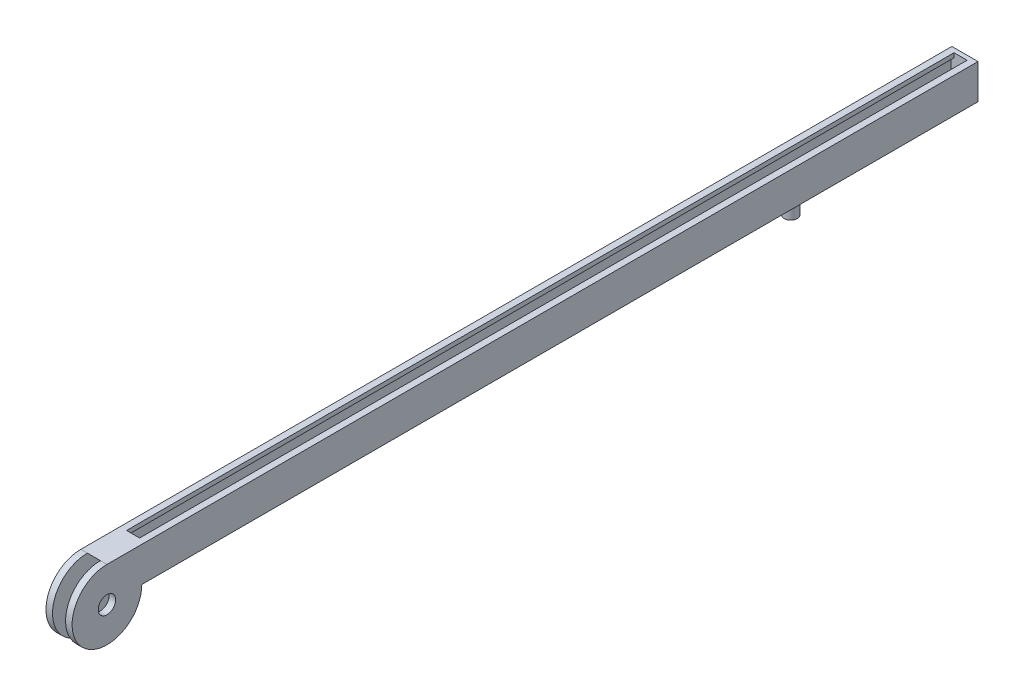
ISO-10303-21;
HEADER;
FILE_DESCRIPTION(('STEP AP214'),'2;1');
FILE_NAME('part.step','',(''),(''),'','','');
FILE_SCHEMA(('AUTOMOTIVE_DESIGN { 1 0 10303 214 1 1 1 1 }'));
ENDSEC;
DATA;
#1=APPLICATION_CONTEXT('core data for automotive mechanical design processes');
#2=APPLICATION_PROTOCOL_DEFINITION('international standard','automotive_design',2000,#1);
#3=PRODUCT_CONTEXT('',#1,'mechanical');
#4=PRODUCT('Part','Part','',(#3));
#5=PRODUCT_RELATED_PRODUCT_CATEGORY('part','',(#4));
#6=PRODUCT_DEFINITION_FORMATION('','',#4);
#7=PRODUCT_DEFINITION_CONTEXT('part definition',#1,'design');
#8=PRODUCT_DEFINITION('design','',#6,#7);
#9=PRODUCT_DEFINITION_SHAPE('','',#8);
#10=(LENGTH_UNIT() NAMED_UNIT(*) SI_UNIT(.MILLI.,.METRE.));
#11=(NAMED_UNIT(*) PLANE_ANGLE_UNIT() SI_UNIT($,.RADIAN.));
#12=(NAMED_UNIT(*) SI_UNIT($,.STERADIAN.) SOLID_ANGLE_UNIT());
#13=UNCERTAINTY_MEASURE_WITH_UNIT(LENGTH_MEASURE(1.E-05),#10,'distance_accuracy_value','');
#14=(GEOMETRIC_REPRESENTATION_CONTEXT(3) GLOBAL_UNCERTAINTY_ASSIGNED_CONTEXT((#13)) GLOBAL_UNIT_ASSIGNED_CONTEXT((#10,
#11,#12)) REPRESENTATION_CONTEXT('',''));
#15=CARTESIAN_POINT('',(0.,0.,0.));
#16=DIRECTION('',(0.,0.,1.));
#17=DIRECTION('',(1.,0.,0.));
#18=AXIS2_PLACEMENT_3D('',#15,#16,#17);
#19=CARTESIAN_POINT('',(-226.274169979695,0.,0.));
#20=DIRECTION('',(1.,0.,0.));
#21=DIRECTION('',(0.,0.,-1.));
#22=AXIS2_PLACEMENT_3D('',#19,#20,#21);
#23=CYLINDRICAL_SURFACE('',#22,80.);
#24=DIRECTION('',(1.,0.,0.));
#25=VECTOR('',#24,1.);
#26=CARTESIAN_POINT('',(0.,80.,0.));
#27=LINE('',#26,#25);
#28=CARTESIAN_POINT('',(45.,80.,0.));
#29=VERTEX_POINT('',#28);
#30=CARTESIAN_POINT('',(60.,80.,0.));
#31=VERTEX_POINT('',#30);
#32=EDGE_CURVE('E162',#29,#31,#27,.T.);
#33=ORIENTED_EDGE('',*,*,#32,.F.);
#34=CARTESIAN_POINT('',(45.,0.,0.));
#35=DIRECTION('',(1.,0.,0.));
#36=DIRECTION('',(0.,0.,-1.));
#37=AXIS2_PLACEMENT_3D('',#34,#35,#36);
#38=CIRCLE('',#37,80.);
#39=CARTESIAN_POINT('',(45.,0.,-80.));
#40=VERTEX_POINT('',#39);
#41=EDGE_CURVE('E148',#29,#40,#38,.T.);
#42=ORIENTED_EDGE('',*,*,#41,.T.);
#43=DIRECTION('',(1.,0.,0.));
#44=VECTOR('',#43,1.);
#45=CARTESIAN_POINT('',(-226.274169979695,0.,-80.));
#46=LINE('',#45,#44);
#47=CARTESIAN_POINT('',(60.,0.,-80.));
#48=VERTEX_POINT('',#47);
#49=EDGE_CURVE('E151',#48,#40,#46,.F.);
#50=ORIENTED_EDGE('',*,*,#49,.F.);
#51=CARTESIAN_POINT('',(60.,0.,0.));
#52=DIRECTION('',(1.,0.,0.));
#53=DIRECTION('',(0.,0.,-1.));
#54=AXIS2_PLACEMENT_3D('',#51,#52,#53);
#55=CIRCLE('',#54,80.);
#56=EDGE_CURVE('E164',#31,#48,#55,.T.);
#57=ORIENTED_EDGE('',*,*,#56,.F.);
#58=EDGE_LOOP('',(#33,#42,#50,#57));
#59=FACE_BOUND('',#58,.T.);
#60=ADVANCED_FACE('F43',(#59),#23,.T.);
#61=CARTESIAN_POINT('',(0.,80.,0.));
#62=DIRECTION('',(0.,1.,0.));
#63=DIRECTION('',(0.,0.,1.));
#64=AXIS2_PLACEMENT_3D('',#61,#62,#63);
#65=PLANE('',#64);
#66=DIRECTION('',(0.,0.,1.));
#67=VECTOR('',#66,1.);
#68=CARTESIAN_POINT('',(-2.35922392732846E-13,80.,-2000.));
#69=LINE('',#68,#67);
#70=CARTESIAN_POINT('',(-2.35922392732846E-13,80.,-2000.));
#71=VERTEX_POINT('',#70);
#72=CARTESIAN_POINT('',(0.,80.,0.));
#73=VERTEX_POINT('',#72);
#74=EDGE_CURVE('E169',#71,#73,#69,.T.);
#75=ORIENTED_EDGE('',*,*,#74,.T.);
#76=CARTESIAN_POINT('',(15.,80.,0.));
#77=VERTEX_POINT('',#76);
#78=EDGE_CURVE('E168',#73,#77,#27,.T.);
#79=ORIENTED_EDGE('',*,*,#78,.T.);
#80=EDGE_CURVE('E160',#77,#29,#27,.T.);
#81=ORIENTED_EDGE('',*,*,#80,.T.);
#82=ORIENTED_EDGE('',*,*,#32,.T.);
#83=DIRECTION('',(0.,0.,-1.));
#84=VECTOR('',#83,1.);
#85=CARTESIAN_POINT('',(60.,80.,0.));
#86=LINE('',#85,#84);
#87=CARTESIAN_POINT('',(60.,80.,-2000.));
#88=VERTEX_POINT('',#87);
#89=EDGE_CURVE('E171',#31,#88,#86,.T.);
#90=ORIENTED_EDGE('',*,*,#89,.T.);
#91=DIRECTION('',(-1.,0.,0.));
#92=VECTOR('',#91,1.);
#93=CARTESIAN_POINT('',(60.,80.,-2000.));
#94=LINE('',#93,#92);
#95=EDGE_CURVE('E178',#88,#71,#94,.T.);
#96=ORIENTED_EDGE('',*,*,#95,.T.);
#97=EDGE_LOOP('',(#75,#79,#81,#82,#90,#96));
#98=FACE_BOUND('',#97,.T.);
#99=DIRECTION('',(0.,0.,1.));
#100=VECTOR('',#99,1.);
#101=CARTESIAN_POINT('',(15.,80.,-1990.));
#102=LINE('',#101,#100);
#103=CARTESIAN_POINT('',(15.,80.,-1990.));
#104=VERTEX_POINT('',#103);
#105=CARTESIAN_POINT('',(15.,80.,-90.));
#106=VERTEX_POINT('',#105);
#107=EDGE_CURVE('E190',#104,#106,#102,.T.);
#108=ORIENTED_EDGE('',*,*,#107,.F.);
#109=DIRECTION('',(1.,0.,0.));
#110=VECTOR('',#109,1.);
#111=CARTESIAN_POINT('',(15.,80.,-1990.));
#112=LINE('',#111,#110);
#113=CARTESIAN_POINT('',(45.,80.,-1990.));
#114=VERTEX_POINT('',#113);
#115=EDGE_CURVE('E256',#104,#114,#112,.T.);
#116=ORIENTED_EDGE('',*,*,#115,.T.);
#117=DIRECTION('',(0.,0.,1.));
#118=VECTOR('',#117,1.);
#119=CARTESIAN_POINT('',(45.,80.,-1990.));
#120=LINE('',#119,#118);
#121=CARTESIAN_POINT('',(45.,80.,-90.));
#122=VERTEX_POINT('',#121);
#123=EDGE_CURVE('E281',#114,#122,#120,.T.);
#124=ORIENTED_EDGE('',*,*,#123,.T.);
#125=DIRECTION('',(1.,0.,0.));
#126=VECTOR('',#125,1.);
#127=CARTESIAN_POINT('',(15.,80.,-90.));
#128=LINE('',#127,#126);
#129=EDGE_CURVE('E238',#106,#122,#128,.T.);
#130=ORIENTED_EDGE('',*,*,#129,.F.);
#131=EDGE_LOOP('',(#108,#116,#124,#130));
#132=FACE_BOUND('',#131,.T.);
#133=ADVANCED_FACE('F173',(#98,#132),#65,.T.);
#134=CARTESIAN_POINT('',(-2.35922392732846E-13,80.,-2000.));
#135=DIRECTION('',(1.,0.,0.));
#136=DIRECTION('',(0.,0.,-1.));
#137=AXIS2_PLACEMENT_3D('',#134,#135,#136);
#138=PLANE('',#137);
#139=CARTESIAN_POINT('',(0.,0.,0.));
#140=DIRECTION('',(1.,0.,0.));
#141=DIRECTION('',(0.,0.,-1.));
#142=AXIS2_PLACEMENT_3D('',#139,#140,#141);
#143=CIRCLE('',#142,20.);
#144=CARTESIAN_POINT('',(0.,0.,-20.));
#145=VERTEX_POINT('',#144);
#146=EDGE_CURVE('E200',#145,#145,#143,.F.);
#147=ORIENTED_EDGE('',*,*,#146,.F.);
#148=EDGE_LOOP('',(#147));
#149=FACE_BOUND('',#148,.T.);
#150=DIRECTION('',(0.,0.,1.));
#151=VECTOR('',#150,1.);
#152=CARTESIAN_POINT('',(-2.35922392732846E-13,0.,-2000.));
#153=LINE('',#152,#151);
#154=CARTESIAN_POINT('',(-2.35922392732846E-13,0.,-2000.));
#155=VERTEX_POINT('',#154);
#156=CARTESIAN_POINT('',(0.,0.,-80.0000000000001));
#157=VERTEX_POINT('',#156);
#158=EDGE_CURVE('E181',#155,#157,#153,.T.);
#159=ORIENTED_EDGE('',*,*,#158,.T.);
#160=CARTESIAN_POINT('',(0.,0.,0.));
#161=DIRECTION('',(1.,0.,0.));
#162=DIRECTION('',(0.,0.,-1.));
#163=AXIS2_PLACEMENT_3D('',#160,#161,#162);
#164=CIRCLE('',#163,80.);
#165=EDGE_CURVE('E234',#157,#73,#164,.F.);
#166=ORIENTED_EDGE('',*,*,#165,.T.);
#167=ORIENTED_EDGE('',*,*,#74,.F.);
#168=DIRECTION('',(0.,-1.,0.));
#169=VECTOR('',#168,1.);
#170=CARTESIAN_POINT('',(-2.35922392732846E-13,80.,-2000.));
#171=LINE('',#170,#169);
#172=EDGE_CURVE('E185',#71,#155,#171,.T.);
#173=ORIENTED_EDGE('',*,*,#172,.T.);
#174=EDGE_LOOP('',(#159,#166,#167,#173));
#175=FACE_BOUND('',#174,.T.);
#176=ADVANCED_FACE('F44',(#149,#175),#138,.F.);
#177=CARTESIAN_POINT('',(60.,80.,0.));
#178=DIRECTION('',(-1.,0.,0.));
#179=DIRECTION('',(0.,0.,1.));
#180=AXIS2_PLACEMENT_3D('',#177,#178,#179);
#181=PLANE('',#180);
#182=CARTESIAN_POINT('',(60.,0.,0.));
#183=DIRECTION('',(1.,0.,0.));
#184=DIRECTION('',(0.,0.,-1.));
#185=AXIS2_PLACEMENT_3D('',#182,#183,#184);
#186=CIRCLE('',#185,20.);
#187=CARTESIAN_POINT('',(60.,0.,-20.));
#188=VERTEX_POINT('',#187);
#189=EDGE_CURVE('E224',#188,#188,#186,.T.);
#190=ORIENTED_EDGE('',*,*,#189,.F.);
#191=EDGE_LOOP('',(#190));
#192=FACE_BOUND('',#191,.T.);
#193=ORIENTED_EDGE('',*,*,#56,.T.);
#194=DIRECTION('',(0.,0.,-1.));
#195=VECTOR('',#194,1.);
#196=CARTESIAN_POINT('',(60.,0.,0.));
#197=LINE('',#196,#195);
#198=CARTESIAN_POINT('',(60.,0.,-2000.));
#199=VERTEX_POINT('',#198);
#200=EDGE_CURVE('E187',#48,#199,#197,.T.);
#201=ORIENTED_EDGE('',*,*,#200,.T.);
#202=DIRECTION('',(0.,-1.,0.));
#203=VECTOR('',#202,1.);
#204=CARTESIAN_POINT('',(60.,80.,-2000.));
#205=LINE('',#204,#203);
#206=EDGE_CURVE('E195',#88,#199,#205,.T.);
#207=ORIENTED_EDGE('',*,*,#206,.F.);
#208=ORIENTED_EDGE('',*,*,#89,.F.);
#209=EDGE_LOOP('',(#193,#201,#207,#208));
#210=FACE_BOUND('',#209,.T.);
#211=ADVANCED_FACE('F416',(#192,#210),#181,.F.);
#212=CARTESIAN_POINT('',(60.,80.,-2000.));
#213=DIRECTION('',(0.,0.,1.));
#214=DIRECTION('',(1.,0.,0.));
#215=AXIS2_PLACEMENT_3D('',#212,#213,#214);
#216=PLANE('',#215);
#217=DIRECTION('',(-1.,0.,0.));
#218=VECTOR('',#217,1.);
#219=CARTESIAN_POINT('',(60.,0.,-2000.));
#220=LINE('',#219,#218);
#221=EDGE_CURVE('E189',#199,#155,#220,.T.);
#222=ORIENTED_EDGE('',*,*,#221,.T.);
#223=ORIENTED_EDGE('',*,*,#172,.F.);
#224=ORIENTED_EDGE('',*,*,#95,.F.);
#225=ORIENTED_EDGE('',*,*,#206,.T.);
#226=EDGE_LOOP('',(#222,#223,#224,#225));
#227=FACE_BOUND('',#226,.T.);
#228=ADVANCED_FACE('F414',(#227),#216,.F.);
#229=CARTESIAN_POINT('',(0.,0.,0.));
#230=DIRECTION('',(0.,1.,0.));
#231=DIRECTION('',(0.,0.,1.));
#232=AXIS2_PLACEMENT_3D('',#229,#230,#231);
#233=PLANE('',#232);
#234=CARTESIAN_POINT('',(29.9999999999999,0.,-1600.));
#235=DIRECTION('',(0.,1.,0.));
#236=DIRECTION('',(0.,0.,1.));
#237=AXIS2_PLACEMENT_3D('',#234,#235,#236);
#238=CIRCLE('',#237,15.);
#239=CARTESIAN_POINT('',(29.9999999999999,0.,-1585.));
#240=VERTEX_POINT('',#239);
#241=EDGE_CURVE('E11',#240,#240,#238,.F.);
#242=ORIENTED_EDGE('',*,*,#241,.F.);
#243=EDGE_LOOP('',(#242));
#244=FACE_BOUND('',#243,.T.);
#245=ORIENTED_EDGE('',*,*,#200,.F.);
#246=ORIENTED_EDGE('',*,*,#49,.T.);
#247=CARTESIAN_POINT('',(15.,0.,-80.));
#248=VERTEX_POINT('',#247);
#249=EDGE_CURVE('E157',#40,#248,#46,.F.);
#250=ORIENTED_EDGE('',*,*,#249,.T.);
#251=EDGE_CURVE('E69',#248,#157,#46,.F.);
#252=ORIENTED_EDGE('',*,*,#251,.T.);
#253=ORIENTED_EDGE('',*,*,#158,.F.);
#254=ORIENTED_EDGE('',*,*,#221,.F.);
#255=EDGE_LOOP('',(#245,#246,#250,#252,#253,#254));
#256=FACE_BOUND('',#255,.T.);
#257=ADVANCED_FACE('F403',(#244,#256),#233,.F.);
#258=CARTESIAN_POINT('',(15.,80.,-1990.));
#259=DIRECTION('',(-1.,0.,0.));
#260=DIRECTION('',(0.,0.,1.));
#261=AXIS2_PLACEMENT_3D('',#258,#259,#260);
#262=PLANE('',#261);
#263=DIRECTION('',(0.,-1.,0.));
#264=VECTOR('',#263,1.);
#265=CARTESIAN_POINT('',(15.,80.,-90.));
#266=LINE('',#265,#264);
#267=CARTESIAN_POINT('',(15.,70.,-90.));
#268=VERTEX_POINT('',#267);
#269=EDGE_CURVE('E233',#106,#268,#266,.T.);
#270=ORIENTED_EDGE('',*,*,#269,.T.);
#271=DIRECTION('',(0.,0.,1.));
#272=VECTOR('',#271,1.);
#273=CARTESIAN_POINT('',(15.,70.,-1990.));
#274=LINE('',#273,#272);
#275=CARTESIAN_POINT('',(15.,70.,-1990.));
#276=VERTEX_POINT('',#275);
#277=EDGE_CURVE('E261',#276,#268,#274,.T.);
#278=ORIENTED_EDGE('',*,*,#277,.F.);
#279=DIRECTION('',(0.,-1.,0.));
#280=VECTOR('',#279,1.);
#281=CARTESIAN_POINT('',(15.,80.,-1990.));
#282=LINE('',#281,#280);
#283=EDGE_CURVE('E237',#104,#276,#282,.T.);
#284=ORIENTED_EDGE('',*,*,#283,.F.);
#285=ORIENTED_EDGE('',*,*,#107,.T.);
#286=EDGE_LOOP('',(#270,#278,#284,#285));
#287=FACE_BOUND('',#286,.T.);
#288=ADVANCED_FACE('F307',(#287),#262,.F.);
#289=CARTESIAN_POINT('',(45.,70.,-1990.));
#290=DIRECTION('',(1.,0.,0.));
#291=DIRECTION('',(0.,0.,-1.));
#292=AXIS2_PLACEMENT_3D('',#289,#290,#291);
#293=PLANE('',#292);
#294=DIRECTION('',(0.,1.,0.));
#295=VECTOR('',#294,1.);
#296=CARTESIAN_POINT('',(45.,70.,-90.));
#297=LINE('',#296,#295);
#298=CARTESIAN_POINT('',(45.,70.,-90.));
#299=VERTEX_POINT('',#298);
#300=EDGE_CURVE('E276',#299,#122,#297,.T.);
#301=ORIENTED_EDGE('',*,*,#300,.T.);
#302=ORIENTED_EDGE('',*,*,#123,.F.);
#303=DIRECTION('',(0.,1.,0.));
#304=VECTOR('',#303,1.);
#305=CARTESIAN_POINT('',(45.,70.,-1990.));
#306=LINE('',#305,#304);
#307=CARTESIAN_POINT('',(45.,70.,-1990.));
#308=VERTEX_POINT('',#307);
#309=EDGE_CURVE('E254',#308,#114,#306,.T.);
#310=ORIENTED_EDGE('',*,*,#309,.F.);
#311=DIRECTION('',(0.,0.,1.));
#312=VECTOR('',#311,1.);
#313=CARTESIAN_POINT('',(45.,70.,-1990.));
#314=LINE('',#313,#312);
#315=EDGE_CURVE('E290',#308,#299,#314,.T.);
#316=ORIENTED_EDGE('',*,*,#315,.T.);
#317=EDGE_LOOP('',(#301,#302,#310,#316));
#318=FACE_BOUND('',#317,.T.);
#319=ADVANCED_FACE('F311',(#318),#293,.F.);
#320=CARTESIAN_POINT('',(52.,70.,-1990.));
#321=DIRECTION('',(0.,1.,0.));
#322=DIRECTION('',(0.,0.,1.));
#323=AXIS2_PLACEMENT_3D('',#320,#321,#322);
#324=PLANE('',#323);
#325=DIRECTION('',(-1.,0.,0.));
#326=VECTOR('',#325,1.);
#327=CARTESIAN_POINT('',(52.,70.,-90.));
#328=LINE('',#327,#326);
#329=CARTESIAN_POINT('',(52.,70.,-90.));
#330=VERTEX_POINT('',#329);
#331=EDGE_CURVE('E277',#330,#299,#328,.T.);
#332=ORIENTED_EDGE('',*,*,#331,.T.);
#333=ORIENTED_EDGE('',*,*,#315,.F.);
#334=DIRECTION('',(-1.,0.,0.));
#335=VECTOR('',#334,1.);
#336=CARTESIAN_POINT('',(52.,70.,-1990.));
#337=LINE('',#336,#335);
#338=CARTESIAN_POINT('',(52.,70.,-1990.));
#339=VERTEX_POINT('',#338);
#340=EDGE_CURVE('E252',#339,#308,#337,.T.);
#341=ORIENTED_EDGE('',*,*,#340,.F.);
#342=DIRECTION('',(0.,0.,1.));
#343=VECTOR('',#342,1.);
#344=CARTESIAN_POINT('',(52.,70.,-1990.));
#345=LINE('',#344,#343);
#346=EDGE_CURVE('E288',#339,#330,#345,.T.);
#347=ORIENTED_EDGE('',*,*,#346,.T.);
#348=EDGE_LOOP('',(#332,#333,#341,#347));
#349=FACE_BOUND('',#348,.T.);
#350=ADVANCED_FACE('F320',(#349),#324,.F.);
#351=CARTESIAN_POINT('',(52.,10.,-1990.));
#352=DIRECTION('',(1.,0.,0.));
#353=DIRECTION('',(0.,0.,-1.));
#354=AXIS2_PLACEMENT_3D('',#351,#352,#353);
#355=PLANE('',#354);
#356=DIRECTION('',(0.,1.,0.));
#357=VECTOR('',#356,1.);
#358=CARTESIAN_POINT('',(52.,10.,-90.));
#359=LINE('',#358,#357);
#360=CARTESIAN_POINT('',(52.,10.,-90.));
#361=VERTEX_POINT('',#360);
#362=EDGE_CURVE('E272',#361,#330,#359,.T.);
#363=ORIENTED_EDGE('',*,*,#362,.T.);
#364=ORIENTED_EDGE('',*,*,#346,.F.);
#365=DIRECTION('',(0.,1.,0.));
#366=VECTOR('',#365,1.);
#367=CARTESIAN_POINT('',(52.,10.,-1990.));
#368=LINE('',#367,#366);
#369=CARTESIAN_POINT('',(52.,10.,-1990.));
#370=VERTEX_POINT('',#369);
#371=EDGE_CURVE('E248',#370,#339,#368,.T.);
#372=ORIENTED_EDGE('',*,*,#371,.F.);
#373=DIRECTION('',(0.,0.,1.));
#374=VECTOR('',#373,1.);
#375=CARTESIAN_POINT('',(52.,10.,-1990.));
#376=LINE('',#375,#374);
#377=EDGE_CURVE('E295',#370,#361,#376,.T.);
#378=ORIENTED_EDGE('',*,*,#377,.T.);
#379=EDGE_LOOP('',(#363,#364,#372,#378));
#380=FACE_BOUND('',#379,.T.);
#381=ADVANCED_FACE('F319',(#380),#355,.F.);
#382=CARTESIAN_POINT('',(8.00000000000001,10.,-1990.));
#383=DIRECTION('',(0.,-1.,0.));
#384=DIRECTION('',(0.,0.,-1.));
#385=AXIS2_PLACEMENT_3D('',#382,#383,#384);
#386=PLANE('',#385);
#387=DIRECTION('',(1.,0.,0.));
#388=VECTOR('',#387,1.);
#389=CARTESIAN_POINT('',(8.00000000000001,10.,-90.));
#390=LINE('',#389,#388);
#391=CARTESIAN_POINT('',(8.00000000000001,10.,-90.));
#392=VERTEX_POINT('',#391);
#393=EDGE_CURVE('E269',#392,#361,#390,.T.);
#394=ORIENTED_EDGE('',*,*,#393,.T.);
#395=ORIENTED_EDGE('',*,*,#377,.F.);
#396=DIRECTION('',(1.,0.,0.));
#397=VECTOR('',#396,1.);
#398=CARTESIAN_POINT('',(8.00000000000001,10.,-1990.));
#399=LINE('',#398,#397);
#400=CARTESIAN_POINT('',(8.00000000000001,10.,-1990.));
#401=VERTEX_POINT('',#400);
#402=EDGE_CURVE('E249',#401,#370,#399,.T.);
#403=ORIENTED_EDGE('',*,*,#402,.F.);
#404=DIRECTION('',(0.,0.,1.));
#405=VECTOR('',#404,1.);
#406=CARTESIAN_POINT('',(8.00000000000001,10.,-1990.));
#407=LINE('',#406,#405);
#408=EDGE_CURVE('E294',#401,#392,#407,.T.);
#409=ORIENTED_EDGE('',*,*,#408,.T.);
#410=EDGE_LOOP('',(#394,#395,#403,#409));
#411=FACE_BOUND('',#410,.T.);
#412=ADVANCED_FACE('F322',(#411),#386,.F.);
#413=CARTESIAN_POINT('',(8.,70.,-1990.));
#414=DIRECTION('',(-1.,0.,0.));
#415=DIRECTION('',(0.,-1.,0.));
#416=AXIS2_PLACEMENT_3D('',#413,#414,#415);
#417=PLANE('',#416);
#418=DIRECTION('',(0.,-1.,0.));
#419=VECTOR('',#418,1.);
#420=CARTESIAN_POINT('',(8.,70.,-90.));
#421=LINE('',#420,#419);
#422=CARTESIAN_POINT('',(8.,70.,-90.));
#423=VERTEX_POINT('',#422);
#424=EDGE_CURVE('E270',#423,#392,#421,.T.);
#425=ORIENTED_EDGE('',*,*,#424,.T.);
#426=ORIENTED_EDGE('',*,*,#408,.F.);
#427=DIRECTION('',(0.,-1.,0.));
#428=VECTOR('',#427,1.);
#429=CARTESIAN_POINT('',(8.,70.,-1990.));
#430=LINE('',#429,#428);
#431=CARTESIAN_POINT('',(8.,70.,-1990.));
#432=VERTEX_POINT('',#431);
#433=EDGE_CURVE('E243',#432,#401,#430,.T.);
#434=ORIENTED_EDGE('',*,*,#433,.F.);
#435=DIRECTION('',(0.,0.,1.));
#436=VECTOR('',#435,1.);
#437=CARTESIAN_POINT('',(8.,70.,-1990.));
#438=LINE('',#437,#436);
#439=EDGE_CURVE('E297',#432,#423,#438,.T.);
#440=ORIENTED_EDGE('',*,*,#439,.T.);
#441=EDGE_LOOP('',(#425,#426,#434,#440));
#442=FACE_BOUND('',#441,.T.);
#443=ADVANCED_FACE('F326',(#442),#417,.F.);
#444=CARTESIAN_POINT('',(15.,70.,-1990.));
#445=DIRECTION('',(0.,1.,0.));
#446=DIRECTION('',(0.,0.,1.));
#447=AXIS2_PLACEMENT_3D('',#444,#445,#446);
#448=PLANE('',#447);
#449=DIRECTION('',(-1.,0.,0.));
#450=VECTOR('',#449,1.);
#451=CARTESIAN_POINT('',(15.,70.,-90.));
#452=LINE('',#451,#450);
#453=EDGE_CURVE('E262',#268,#423,#452,.T.);
#454=ORIENTED_EDGE('',*,*,#453,.T.);
#455=ORIENTED_EDGE('',*,*,#439,.F.);
#456=DIRECTION('',(-1.,0.,0.));
#457=VECTOR('',#456,1.);
#458=CARTESIAN_POINT('',(15.,70.,-1990.));
#459=LINE('',#458,#457);
#460=EDGE_CURVE('E239',#276,#432,#459,.T.);
#461=ORIENTED_EDGE('',*,*,#460,.F.);
#462=ORIENTED_EDGE('',*,*,#277,.T.);
#463=EDGE_LOOP('',(#454,#455,#461,#462));
#464=FACE_BOUND('',#463,.T.);
#465=ADVANCED_FACE('F296',(#464),#448,.F.);
#466=CARTESIAN_POINT('',(0.,0.,-1990.));
#467=DIRECTION('',(0.,0.,-1.));
#468=DIRECTION('',(-1.,0.,0.));
#469=AXIS2_PLACEMENT_3D('',#466,#467,#468);
#470=PLANE('',#469);
#471=ORIENTED_EDGE('',*,*,#283,.T.);
#472=ORIENTED_EDGE('',*,*,#460,.T.);
#473=ORIENTED_EDGE('',*,*,#433,.T.);
#474=ORIENTED_EDGE('',*,*,#402,.T.);
#475=ORIENTED_EDGE('',*,*,#371,.T.);
#476=ORIENTED_EDGE('',*,*,#340,.T.);
#477=ORIENTED_EDGE('',*,*,#309,.T.);
#478=ORIENTED_EDGE('',*,*,#115,.F.);
#479=EDGE_LOOP('',(#471,#472,#473,#474,#475,#476,#477,#478));
#480=FACE_BOUND('',#479,.T.);
#481=ADVANCED_FACE('F328',(#480),#470,.F.);
#482=CARTESIAN_POINT('',(0.,0.,-90.));
#483=DIRECTION('',(0.,0.,-1.));
#484=DIRECTION('',(-1.,0.,0.));
#485=AXIS2_PLACEMENT_3D('',#482,#483,#484);
#486=PLANE('',#485);
#487=ORIENTED_EDGE('',*,*,#269,.F.);
#488=ORIENTED_EDGE('',*,*,#129,.T.);
#489=ORIENTED_EDGE('',*,*,#300,.F.);
#490=ORIENTED_EDGE('',*,*,#331,.F.);
#491=ORIENTED_EDGE('',*,*,#362,.F.);
#492=ORIENTED_EDGE('',*,*,#393,.F.);
#493=ORIENTED_EDGE('',*,*,#424,.F.);
#494=ORIENTED_EDGE('',*,*,#453,.F.);
#495=EDGE_LOOP('',(#487,#488,#489,#490,#491,#492,#493,#494));
#496=FACE_BOUND('',#495,.T.);
#497=ADVANCED_FACE('F302',(#496),#486,.T.);
#498=CARTESIAN_POINT('',(15.,0.,0.));
#499=DIRECTION('',(1.,0.,0.));
#500=DIRECTION('',(0.,0.,-1.));
#501=AXIS2_PLACEMENT_3D('',#498,#499,#500);
#502=CIRCLE('',#501,80.);
#503=EDGE_CURVE('E55',#77,#248,#502,.T.);
#504=ORIENTED_EDGE('',*,*,#503,.F.);
#505=ORIENTED_EDGE('',*,*,#78,.F.);
#506=ORIENTED_EDGE('',*,*,#165,.F.);
#507=ORIENTED_EDGE('',*,*,#251,.F.);
#508=EDGE_LOOP('',(#504,#505,#506,#507));
#509=FACE_BOUND('',#508,.T.);
#510=ADVANCED_FACE('F337',(#509),#23,.T.);
#511=CARTESIAN_POINT('',(15.,0.,0.));
#512=DIRECTION('',(1.,0.,0.));
#513=DIRECTION('',(0.,0.,-1.));
#514=AXIS2_PLACEMENT_3D('',#511,#512,#513);
#515=CYLINDRICAL_SURFACE('',#514,80.);
#516=EDGE_CURVE('E159',#248,#77,#502,.T.);
#517=ORIENTED_EDGE('',*,*,#516,.F.);
#518=ORIENTED_EDGE('',*,*,#249,.F.);
#519=EDGE_CURVE('E56',#40,#29,#38,.T.);
#520=ORIENTED_EDGE('',*,*,#519,.T.);
#521=ORIENTED_EDGE('',*,*,#80,.F.);
#522=EDGE_LOOP('',(#517,#518,#520,#521));
#523=FACE_BOUND('',#522,.T.);
#524=ADVANCED_FACE('F154',(#523),#515,.F.);
#525=CARTESIAN_POINT('',(15.,0.,0.));
#526=DIRECTION('',(1.,0.,0.));
#527=DIRECTION('',(0.,0.,-1.));
#528=AXIS2_PLACEMENT_3D('',#525,#526,#527);
#529=PLANE('',#528);
#530=CARTESIAN_POINT('',(15.,0.,0.));
#531=DIRECTION('',(1.,0.,0.));
#532=DIRECTION('',(0.,0.,-1.));
#533=AXIS2_PLACEMENT_3D('',#530,#531,#532);
#534=CIRCLE('',#533,20.);
#535=CARTESIAN_POINT('',(15.,0.,-20.));
#536=VERTEX_POINT('',#535);
#537=EDGE_CURVE('E161',#536,#536,#534,.T.);
#538=ORIENTED_EDGE('',*,*,#537,.F.);
#539=EDGE_LOOP('',(#538));
#540=FACE_BOUND('',#539,.T.);
#541=ORIENTED_EDGE('',*,*,#516,.T.);
#542=ORIENTED_EDGE('',*,*,#503,.T.);
#543=EDGE_LOOP('',(#541,#542));
#544=FACE_BOUND('',#543,.T.);
#545=ADVANCED_FACE('F352',(#540,#544),#529,.T.);
#546=CARTESIAN_POINT('',(45.,0.,0.));
#547=DIRECTION('',(1.,0.,0.));
#548=DIRECTION('',(0.,0.,-1.));
#549=AXIS2_PLACEMENT_3D('',#546,#547,#548);
#550=PLANE('',#549);
#551=CARTESIAN_POINT('',(45.,0.,0.));
#552=DIRECTION('',(1.,0.,0.));
#553=DIRECTION('',(0.,0.,-1.));
#554=AXIS2_PLACEMENT_3D('',#551,#552,#553);
#555=CIRCLE('',#554,20.);
#556=CARTESIAN_POINT('',(45.,0.,-20.));
#557=VERTEX_POINT('',#556);
#558=EDGE_CURVE('E197',#557,#557,#555,.T.);
#559=ORIENTED_EDGE('',*,*,#558,.T.);
#560=EDGE_LOOP('',(#559));
#561=FACE_BOUND('',#560,.T.);
#562=ORIENTED_EDGE('',*,*,#519,.F.);
#563=ORIENTED_EDGE('',*,*,#41,.F.);
#564=EDGE_LOOP('',(#562,#563));
#565=FACE_BOUND('',#564,.T.);
#566=ADVANCED_FACE('F150',(#561,#565),#550,.F.);
#567=CARTESIAN_POINT('',(-56.5685424949238,0.,0.));
#568=DIRECTION('',(1.,0.,0.));
#569=DIRECTION('',(0.,0.,-1.));
#570=AXIS2_PLACEMENT_3D('',#567,#568,#569);
#571=CYLINDRICAL_SURFACE('',#570,20.);
#572=CARTESIAN_POINT('',(60.,0.,-20.));
#573=CARTESIAN_POINT('',(59.84375,0.,-20.));
#574=CARTESIAN_POINT('',(59.6875,0.,-20.));
#575=CARTESIAN_POINT('',(59.375,0.,-20.));
#576=CARTESIAN_POINT('',(59.21875,0.,-20.));
#577=CARTESIAN_POINT('',(58.90625,0.,-20.));
#578=CARTESIAN_POINT('',(58.75,0.,-20.));
#579=CARTESIAN_POINT('',(58.4375,0.,-20.));
#580=CARTESIAN_POINT('',(58.28125,0.,-20.));
#581=CARTESIAN_POINT('',(57.96875,0.,-20.));
#582=CARTESIAN_POINT('',(57.8125,0.,-20.));
#583=CARTESIAN_POINT('',(57.5,0.,-20.));
#584=CARTESIAN_POINT('',(57.34375,0.,-20.));
#585=CARTESIAN_POINT('',(57.03125,0.,-20.));
#586=CARTESIAN_POINT('',(56.875,0.,-20.));
#587=CARTESIAN_POINT('',(56.5625,0.,-20.));
#588=CARTESIAN_POINT('',(56.40625,0.,-20.));
#589=CARTESIAN_POINT('',(56.09375,0.,-20.));
#590=CARTESIAN_POINT('',(55.9375,0.,-20.));
#591=CARTESIAN_POINT('',(55.625,0.,-20.));
#592=CARTESIAN_POINT('',(55.46875,0.,-20.));
#593=CARTESIAN_POINT('',(55.15625,0.,-20.));
#594=CARTESIAN_POINT('',(55.,0.,-20.));
#595=CARTESIAN_POINT('',(54.6875,0.,-20.));
#596=CARTESIAN_POINT('',(54.53125,0.,-20.));
#597=CARTESIAN_POINT('',(54.21875,0.,-20.));
#598=CARTESIAN_POINT('',(54.0625,0.,-20.));
#599=CARTESIAN_POINT('',(53.75,0.,-20.));
#600=CARTESIAN_POINT('',(53.59375,0.,-20.));
#601=CARTESIAN_POINT('',(53.28125,0.,-20.));
#602=CARTESIAN_POINT('',(53.125,0.,-20.));
#603=CARTESIAN_POINT('',(52.8125,0.,-20.));
#604=CARTESIAN_POINT('',(52.65625,0.,-20.));
#605=CARTESIAN_POINT('',(52.34375,0.,-20.));
#606=CARTESIAN_POINT('',(52.1875,0.,-20.));
#607=CARTESIAN_POINT('',(51.875,0.,-20.));
#608=CARTESIAN_POINT('',(51.71875,0.,-20.));
#609=CARTESIAN_POINT('',(51.40625,0.,-20.));
#610=CARTESIAN_POINT('',(51.25,0.,-20.));
#611=CARTESIAN_POINT('',(50.9375,0.,-20.));
#612=CARTESIAN_POINT('',(50.78125,0.,-20.));
#613=CARTESIAN_POINT('',(50.46875,0.,-20.));
#614=CARTESIAN_POINT('',(50.3125,0.,-20.));
#615=CARTESIAN_POINT('',(50.,0.,-20.));
#616=CARTESIAN_POINT('',(49.84375,0.,-20.));
#617=CARTESIAN_POINT('',(49.53125,0.,-20.));
#618=CARTESIAN_POINT('',(49.375,0.,-20.));
#619=CARTESIAN_POINT('',(49.0625,0.,-20.));
#620=CARTESIAN_POINT('',(48.90625,0.,-20.));
#621=CARTESIAN_POINT('',(48.59375,0.,-20.));
#622=CARTESIAN_POINT('',(48.4375,0.,-20.));
#623=CARTESIAN_POINT('',(48.125,0.,-20.));
#624=CARTESIAN_POINT('',(47.96875,0.,-20.));
#625=CARTESIAN_POINT('',(47.65625,0.,-20.));
#626=CARTESIAN_POINT('',(47.5,0.,-20.));
#627=CARTESIAN_POINT('',(47.1875,0.,-20.));
#628=CARTESIAN_POINT('',(47.03125,0.,-20.));
#629=CARTESIAN_POINT('',(46.71875,0.,-20.));
#630=CARTESIAN_POINT('',(46.5625,0.,-20.));
#631=CARTESIAN_POINT('',(46.25,0.,-20.));
#632=CARTESIAN_POINT('',(46.09375,0.,-20.));
#633=CARTESIAN_POINT('',(45.78125,0.,-20.));
#634=CARTESIAN_POINT('',(45.625,0.,-20.));
#635=CARTESIAN_POINT('',(45.3125,0.,-20.));
#636=CARTESIAN_POINT('',(45.15625,0.,-20.));
#637=CARTESIAN_POINT('',(45.,0.,-20.));
#638=B_SPLINE_CURVE_WITH_KNOTS('',3,(#572,#573,#574,#575,#576,#577,#578,#579,#580,#581,#582,
#583,#584,#585,#586,#587,#588,#589,#590,#591,#592,#593,#594,#595,#596,#597,#598,#599,#600,#601,
#602,#603,#604,#605,#606,#607,#608,#609,#610,#611,#612,#613,#614,#615,#616,#617,#618,#619,#620,
#621,#622,#623,#624,#625,#626,#627,#628,#629,#630,#631,#632,#633,#634,#635,#636,#637),
.UNSPECIFIED.,.F.,.F.,(4,2,2,2,2,2,2,2,2,2,2,2,2,2,2,2,2,2,2,2,2,2,2,2,2,2,2,2,2,2,2,2,4),(0.,
0.468750000000004,0.937499999999994,1.40625,1.875,2.34374999999999,2.8125,3.28125,3.75,
4.21874999999999,4.6875,5.15625,5.62499999999999,6.09374999999999,6.5625,7.03124999999999,
7.49999999999999,7.96875,8.43749999999999,8.90624999999999,9.37499999999999,9.84374999999998,
10.3125,10.78125,11.25,11.71875,12.1875,12.65625,13.125,13.59375,14.0625,14.53125,15.),.UNSPECIFIED.);
#639=EDGE_CURVE('BSEAM363',#188,#557,#638,.T.);
#640=ORIENTED_EDGE('',*,*,#189,.T.);
#641=ORIENTED_EDGE('',*,*,#558,.F.);
#642=ORIENTED_EDGE('',*,*,#639,.T.);
#643=ORIENTED_EDGE('',*,*,#639,.F.);
#644=EDGE_LOOP('',(#640,#642,#641,#643));
#645=FACE_BOUND('',#644,.T.);
#646=ADVANCED_FACE('F363',(#645),#571,.F.);
#647=CARTESIAN_POINT('',(15.,0.,-20.));
#648=CARTESIAN_POINT('',(14.84375,0.,-20.));
#649=CARTESIAN_POINT('',(14.6875,0.,-20.));
#650=CARTESIAN_POINT('',(14.375,0.,-20.));
#651=CARTESIAN_POINT('',(14.21875,0.,-20.));
#652=CARTESIAN_POINT('',(13.90625,0.,-20.));
#653=CARTESIAN_POINT('',(13.75,0.,-20.));
#654=CARTESIAN_POINT('',(13.4375,0.,-20.));
#655=CARTESIAN_POINT('',(13.28125,0.,-20.));
#656=CARTESIAN_POINT('',(12.96875,0.,-20.));
#657=CARTESIAN_POINT('',(12.8125,0.,-20.));
#658=CARTESIAN_POINT('',(12.5,0.,-20.));
#659=CARTESIAN_POINT('',(12.34375,0.,-20.));
#660=CARTESIAN_POINT('',(12.03125,0.,-20.));
#661=CARTESIAN_POINT('',(11.875,0.,-20.));
#662=CARTESIAN_POINT('',(11.5625,0.,-20.));
#663=CARTESIAN_POINT('',(11.40625,0.,-20.));
#664=CARTESIAN_POINT('',(11.09375,0.,-20.));
#665=CARTESIAN_POINT('',(10.9375,0.,-20.));
#666=CARTESIAN_POINT('',(10.625,0.,-20.));
#667=CARTESIAN_POINT('',(10.46875,0.,-20.));
#668=CARTESIAN_POINT('',(10.15625,0.,-20.));
#669=CARTESIAN_POINT('',(9.99999999999999,0.,-20.));
#670=CARTESIAN_POINT('',(9.6875,0.,-20.));
#671=CARTESIAN_POINT('',(9.53125,0.,-20.));
#672=CARTESIAN_POINT('',(9.21874999999999,0.,-20.));
#673=CARTESIAN_POINT('',(9.06249999999999,0.,-20.));
#674=CARTESIAN_POINT('',(8.74999999999999,0.,-20.));
#675=CARTESIAN_POINT('',(8.59375,0.,-20.));
#676=CARTESIAN_POINT('',(8.28125,0.,-20.));
#677=CARTESIAN_POINT('',(8.125,0.,-20.));
#678=CARTESIAN_POINT('',(7.8125,0.,-20.));
#679=CARTESIAN_POINT('',(7.65624999999999,0.,-20.));
#680=CARTESIAN_POINT('',(7.34374999999999,0.,-20.));
#681=CARTESIAN_POINT('',(7.18749999999999,0.,-20.));
#682=CARTESIAN_POINT('',(6.87499999999999,0.,-20.));
#683=CARTESIAN_POINT('',(6.71874999999999,0.,-20.));
#684=CARTESIAN_POINT('',(6.40624999999999,0.,-20.));
#685=CARTESIAN_POINT('',(6.24999999999999,0.,-20.));
#686=CARTESIAN_POINT('',(5.9375,0.,-20.));
#687=CARTESIAN_POINT('',(5.78125,0.,-20.));
#688=CARTESIAN_POINT('',(5.46875,0.,-20.));
#689=CARTESIAN_POINT('',(5.3125,0.,-20.));
#690=CARTESIAN_POINT('',(4.99999999999999,0.,-20.));
#691=CARTESIAN_POINT('',(4.84375,0.,-20.));
#692=CARTESIAN_POINT('',(4.53125,0.,-20.));
#693=CARTESIAN_POINT('',(4.375,0.,-20.));
#694=CARTESIAN_POINT('',(4.0625,0.,-20.));
#695=CARTESIAN_POINT('',(3.90625,0.,-20.));
#696=CARTESIAN_POINT('',(3.59375,0.,-20.));
#697=CARTESIAN_POINT('',(3.43749999999999,0.,-20.));
#698=CARTESIAN_POINT('',(3.12499999999999,0.,-20.));
#699=CARTESIAN_POINT('',(2.96874999999999,0.,-20.));
#700=CARTESIAN_POINT('',(2.65625,0.,-20.));
#701=CARTESIAN_POINT('',(2.5,0.,-20.));
#702=CARTESIAN_POINT('',(2.1875,0.,-20.));
#703=CARTESIAN_POINT('',(2.03125,0.,-20.));
#704=CARTESIAN_POINT('',(1.71874999999999,0.,-20.));
#705=CARTESIAN_POINT('',(1.56249999999999,0.,-20.));
#706=CARTESIAN_POINT('',(1.24999999999999,0.,-20.));
#707=CARTESIAN_POINT('',(1.09374999999999,0.,-20.));
#708=CARTESIAN_POINT('',(0.781249999999995,0.,-20.));
#709=CARTESIAN_POINT('',(0.624999999999996,0.,-20.));
#710=CARTESIAN_POINT('',(0.312499999999996,0.,-20.));
#711=CARTESIAN_POINT('',(0.156249999999995,0.,-20.));
#712=CARTESIAN_POINT('',(0.,0.,-20.));
#713=B_SPLINE_CURVE_WITH_KNOTS('',3,(#647,#648,#649,#650,#651,#652,#653,#654,#655,#656,#657,
#658,#659,#660,#661,#662,#663,#664,#665,#666,#667,#668,#669,#670,#671,#672,#673,#674,#675,#676,
#677,#678,#679,#680,#681,#682,#683,#684,#685,#686,#687,#688,#689,#690,#691,#692,#693,#694,#695,
#696,#697,#698,#699,#700,#701,#702,#703,#704,#705,#706,#707,#708,#709,#710,#711,#712),
.UNSPECIFIED.,.F.,.F.,(4,2,2,2,2,2,2,2,2,2,2,2,2,2,2,2,2,2,2,2,2,2,2,2,2,2,2,2,2,2,2,2,4),(0.,
0.468750000000004,0.937500000000008,1.40625,1.875,2.34375000000001,2.8125,3.28125,3.75,
4.21875000000001,4.68750000000001,5.15625,5.62500000000001,6.09375000000001,6.5625,7.03125,
7.50000000000001,7.96875000000001,8.43750000000001,8.90625,9.375,9.84375000000001,10.3125,
10.78125,11.25,11.71875,12.1875,12.65625,13.125,13.59375,14.0625,14.53125,15.),.UNSPECIFIED.);
#714=EDGE_CURVE('BSEAM368',#536,#145,#713,.T.);
#715=ORIENTED_EDGE('',*,*,#537,.T.);
#716=ORIENTED_EDGE('',*,*,#146,.T.);
#717=ORIENTED_EDGE('',*,*,#714,.T.);
#718=ORIENTED_EDGE('',*,*,#714,.F.);
#719=EDGE_LOOP('',(#715,#717,#716,#718));
#720=FACE_BOUND('',#719,.T.);
#721=ADVANCED_FACE('F368',(#720),#571,.F.);
#722=CARTESIAN_POINT('',(29.9999999999999,-40.,-1600.));
#723=DIRECTION('',(0.,-1.,0.));
#724=DIRECTION('',(0.,0.,-1.));
#725=AXIS2_PLACEMENT_3D('',#722,#723,#724);
#726=PLANE('',#725);
#727=CARTESIAN_POINT('',(29.9999999999999,-40.,-1600.));
#728=DIRECTION('',(0.,-1.,0.));
#729=DIRECTION('',(0.,0.,-1.));
#730=AXIS2_PLACEMENT_3D('',#727,#728,#729);
#731=CIRCLE('',#730,15.);
#732=CARTESIAN_POINT('',(29.9999999999999,-40.,-1615.));
#733=VERTEX_POINT('',#732);
#734=EDGE_CURVE('E217',#733,#733,#731,.T.);
#735=ORIENTED_EDGE('',*,*,#734,.T.);
#736=EDGE_LOOP('',(#735));
#737=FACE_BOUND('',#736,.T.);
#738=CARTESIAN_POINT('',(29.9999999999999,-40.,-1600.));
#739=DIRECTION('',(0.,-1.,0.));
#740=DIRECTION('',(0.,0.,-1.));
#741=AXIS2_PLACEMENT_3D('',#738,#739,#740);
#742=CIRCLE('',#741,7.49999999999997);
#743=CARTESIAN_POINT('',(29.9999999999999,-40.,-1607.5));
#744=VERTEX_POINT('',#743);
#745=EDGE_CURVE('E214',#744,#744,#742,.T.);
#746=ORIENTED_EDGE('',*,*,#745,.F.);
#747=EDGE_LOOP('',(#746));
#748=FACE_BOUND('',#747,.T.);
#749=ADVANCED_FACE('F369',(#737,#748),#726,.T.);
#750=CARTESIAN_POINT('',(29.9999999999999,-40.,-1600.));
#751=DIRECTION('',(0.,1.,0.));
#752=DIRECTION('',(0.,0.,1.));
#753=AXIS2_PLACEMENT_3D('',#750,#751,#752);
#754=CYLINDRICAL_SURFACE('',#753,15.);
#755=ORIENTED_EDGE('',*,*,#734,.F.);
#756=EDGE_LOOP('',(#755));
#757=FACE_BOUND('',#756,.T.);
#758=ORIENTED_EDGE('',*,*,#241,.T.);
#759=EDGE_LOOP('',(#758));
#760=FACE_BOUND('',#759,.T.);
#761=ADVANCED_FACE('F371',(#757,#760),#754,.T.);
#762=CARTESIAN_POINT('',(29.9999999999999,-40.,-1600.));
#763=DIRECTION('',(0.,1.,0.));
#764=DIRECTION('',(0.,0.,1.));
#765=AXIS2_PLACEMENT_3D('',#762,#763,#764);
#766=CYLINDRICAL_SURFACE('',#765,7.49999999999997);
#767=CARTESIAN_POINT('',(29.9999999999999,-25.,-1600.));
#768=DIRECTION('',(0.,-1.,0.));
#769=DIRECTION('',(0.,0.,-1.));
#770=AXIS2_PLACEMENT_3D('',#767,#768,#769);
#771=CIRCLE('',#770,7.49999999999997);
#772=CARTESIAN_POINT('',(29.9999999999999,-25.,-1607.5));
#773=VERTEX_POINT('',#772);
#774=EDGE_CURVE('E199',#773,#773,#771,.T.);
#775=ORIENTED_EDGE('',*,*,#774,.F.);
#776=EDGE_LOOP('',(#775));
#777=FACE_BOUND('',#776,.T.);
#778=ORIENTED_EDGE('',*,*,#745,.T.);
#779=EDGE_LOOP('',(#778));
#780=FACE_BOUND('',#779,.T.);
#781=ADVANCED_FACE('F372',(#777,#780),#766,.F.);
#782=CARTESIAN_POINT('',(29.9999999999999,-23.,-1600.));
#783=DIRECTION('',(0.,-1.,0.));
#784=DIRECTION('',(0.,0.,-1.));
#785=AXIS2_PLACEMENT_3D('',#782,#783,#784);
#786=CYLINDRICAL_SURFACE('',#785,10.4999999999999);
#787=CARTESIAN_POINT('',(29.9999999999999,-23.,-1600.));
#788=DIRECTION('',(0.,-1.,0.));
#789=DIRECTION('',(0.,0.,-1.));
#790=AXIS2_PLACEMENT_3D('',#787,#788,#789);
#791=CIRCLE('',#790,10.4999999999999);
#792=CARTESIAN_POINT('',(29.9999999999999,-23.,-1610.5));
#793=VERTEX_POINT('',#792);
#794=EDGE_CURVE('E205',#793,#793,#791,.T.);
#795=ORIENTED_EDGE('',*,*,#794,.F.);
#796=EDGE_LOOP('',(#795));
#797=FACE_BOUND('',#796,.T.);
#798=CARTESIAN_POINT('',(29.9999999999999,-25.,-1600.));
#799=DIRECTION('',(0.,-1.,0.));
#800=DIRECTION('',(0.,0.,-1.));
#801=AXIS2_PLACEMENT_3D('',#798,#799,#800);
#802=CIRCLE('',#801,10.4999999999999);
#803=CARTESIAN_POINT('',(29.9999999999999,-25.,-1610.5));
#804=VERTEX_POINT('',#803);
#805=EDGE_CURVE('E208',#804,#804,#802,.T.);
#806=ORIENTED_EDGE('',*,*,#805,.T.);
#807=EDGE_LOOP('',(#806));
#808=FACE_BOUND('',#807,.T.);
#809=ADVANCED_FACE('F381',(#797,#808),#786,.F.);
#810=CARTESIAN_POINT('',(29.9999999999999,-23.,-1600.));
#811=DIRECTION('',(0.,-1.,0.));
#812=DIRECTION('',(0.,0.,-1.));
#813=AXIS2_PLACEMENT_3D('',#810,#811,#812);
#814=PLANE('',#813);
#815=CARTESIAN_POINT('',(29.9999999999999,-23.,-1600.));
#816=DIRECTION('',(0.,-1.,0.));
#817=DIRECTION('',(0.,0.,-1.));
#818=AXIS2_PLACEMENT_3D('',#815,#816,#817);
#819=CIRCLE('',#818,7.49999999999997);
#820=CARTESIAN_POINT('',(29.9999999999999,-23.,-1607.5));
#821=VERTEX_POINT('',#820);
#822=EDGE_CURVE('E50',#821,#821,#819,.T.);
#823=ORIENTED_EDGE('',*,*,#822,.F.);
#824=EDGE_LOOP('',(#823));
#825=FACE_BOUND('',#824,.T.);
#826=ORIENTED_EDGE('',*,*,#794,.T.);
#827=EDGE_LOOP('',(#826));
#828=FACE_BOUND('',#827,.T.);
#829=ADVANCED_FACE('F387',(#825,#828),#814,.T.);
#830=CARTESIAN_POINT('',(29.9999999999999,-25.,-1600.));
#831=DIRECTION('',(0.,-1.,0.));
#832=DIRECTION('',(0.,0.,-1.));
#833=AXIS2_PLACEMENT_3D('',#830,#831,#832);
#834=PLANE('',#833);
#835=ORIENTED_EDGE('',*,*,#774,.T.);
#836=EDGE_LOOP('',(#835));
#837=FACE_BOUND('',#836,.T.);
#838=ORIENTED_EDGE('',*,*,#805,.F.);
#839=EDGE_LOOP('',(#838));
#840=FACE_BOUND('',#839,.T.);
#841=ADVANCED_FACE('F389',(#837,#840),#834,.F.);
#842=CARTESIAN_POINT('',(29.9999999999999,0.,-1600.));
#843=DIRECTION('',(0.,-1.,0.));
#844=DIRECTION('',(0.,0.,-1.));
#845=AXIS2_PLACEMENT_3D('',#842,#843,#844);
#846=CIRCLE('',#845,7.49999999999997);
#847=CARTESIAN_POINT('',(29.9999999999999,0.,-1607.5));
#848=VERTEX_POINT('',#847);
#849=EDGE_CURVE('E206',#848,#848,#846,.T.);
#850=ORIENTED_EDGE('',*,*,#849,.T.);
#851=EDGE_LOOP('',(#850));
#852=FACE_BOUND('',#851,.T.);
#853=ADVANCED_FACE('F392',(#852),#233,.F.);
#854=ORIENTED_EDGE('',*,*,#849,.F.);
#855=EDGE_LOOP('',(#854));
#856=FACE_BOUND('',#855,.T.);
#857=ORIENTED_EDGE('',*,*,#822,.T.);
#858=EDGE_LOOP('',(#857));
#859=FACE_BOUND('',#858,.T.);
#860=ADVANCED_FACE('F382',(#856,#859),#766,.F.);
#861=CLOSED_SHELL('',(#60,#133,#176,#211,#228,#257,#288,#319,#350,#381,#412,#443,#465,#481,#497,
#510,#524,#545,#566,#646,#721,#749,#761,#781,#809,#829,#841,#853,#860));
#862=MANIFOLD_SOLID_BREP('B2',#861);
#863=ADVANCED_BREP_SHAPE_REPRESENTATION('',(#18,#862),#14);
#864=SHAPE_DEFINITION_REPRESENTATION(#9,#863);
ENDSEC;
END-ISO-10303-21;
